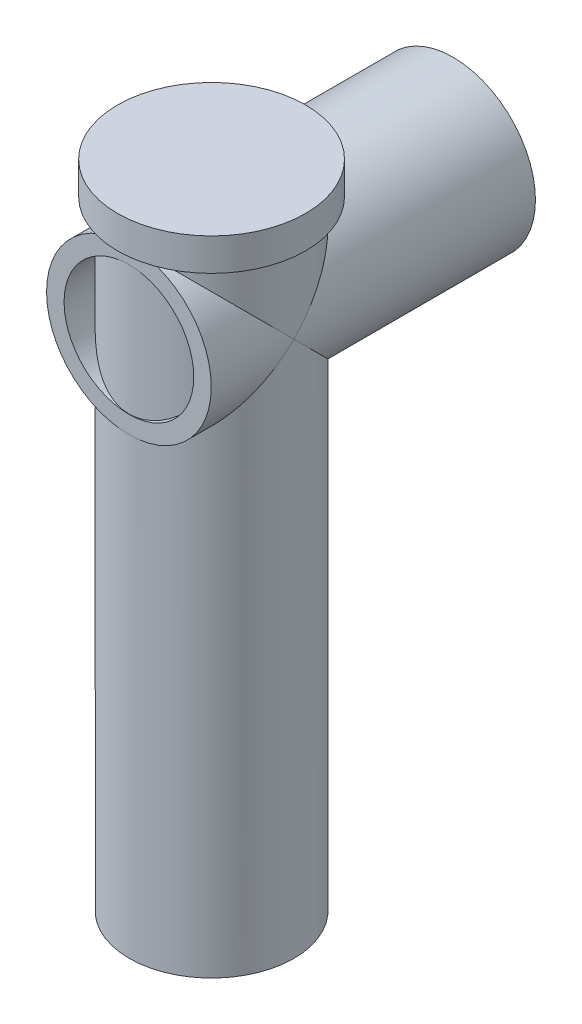
ISO-10303-21;
HEADER;
FILE_DESCRIPTION(('STEP AP214'),'2;1');
FILE_NAME('part.step','',(''),(''),'','','');
FILE_SCHEMA(('AUTOMOTIVE_DESIGN { 1 0 10303 214 1 1 1 1 }'));
ENDSEC;
DATA;
#1=APPLICATION_CONTEXT('core data for automotive mechanical design processes');
#2=APPLICATION_PROTOCOL_DEFINITION('international standard','automotive_design',2000,#1);
#3=PRODUCT_CONTEXT('',#1,'mechanical');
#4=PRODUCT('Part','Part','',(#3));
#5=PRODUCT_RELATED_PRODUCT_CATEGORY('part','',(#4));
#6=PRODUCT_DEFINITION_FORMATION('','',#4);
#7=PRODUCT_DEFINITION_CONTEXT('part definition',#1,'design');
#8=PRODUCT_DEFINITION('design','',#6,#7);
#9=PRODUCT_DEFINITION_SHAPE('','',#8);
#10=(LENGTH_UNIT() NAMED_UNIT(*) SI_UNIT(.MILLI.,.METRE.));
#11=(NAMED_UNIT(*) PLANE_ANGLE_UNIT() SI_UNIT($,.RADIAN.));
#12=(NAMED_UNIT(*) SI_UNIT($,.STERADIAN.) SOLID_ANGLE_UNIT());
#13=UNCERTAINTY_MEASURE_WITH_UNIT(LENGTH_MEASURE(1.E-05),#10,'distance_accuracy_value','');
#14=(GEOMETRIC_REPRESENTATION_CONTEXT(3) GLOBAL_UNCERTAINTY_ASSIGNED_CONTEXT((#13)) GLOBAL_UNIT_ASSIGNED_CONTEXT((#10,
#11,#12)) REPRESENTATION_CONTEXT('',''));
#15=CARTESIAN_POINT('',(0.,0.,0.));
#16=DIRECTION('',(0.,0.,1.));
#17=DIRECTION('',(1.,0.,0.));
#18=AXIS2_PLACEMENT_3D('',#15,#16,#17);
#19=CARTESIAN_POINT('',(0.,17.7,37.25));
#20=DIRECTION('',(0.,-1.,0.));
#21=DIRECTION('',(0.,0.,-1.));
#22=AXIS2_PLACEMENT_3D('',#19,#20,#21);
#23=CYLINDRICAL_SURFACE('',#22,14.5);
#24=CARTESIAN_POINT('',(0.,17.7,37.25));
#25=DIRECTION('',(0.,1.,0.));
#26=DIRECTION('',(0.,0.,1.));
#27=AXIS2_PLACEMENT_3D('',#24,#25,#26);
#28=CIRCLE('',#27,14.5);
#29=CARTESIAN_POINT('',(0.,17.7,51.75));
#30=VERTEX_POINT('',#29);
#31=EDGE_CURVE('E11',#30,#30,#28,.T.);
#32=ORIENTED_EDGE('',*,*,#31,.F.);
#33=EDGE_LOOP('',(#32));
#34=FACE_BOUND('',#33,.T.);
#35=CARTESIAN_POINT('',(0.,12.7,37.25));
#36=DIRECTION('',(0.,1.,0.));
#37=DIRECTION('',(0.,0.,1.));
#38=AXIS2_PLACEMENT_3D('',#35,#36,#37);
#39=CIRCLE('',#38,14.5);
#40=CARTESIAN_POINT('',(0.,12.7,51.75));
#41=VERTEX_POINT('',#40);
#42=EDGE_CURVE('E46',#41,#41,#39,.T.);
#43=ORIENTED_EDGE('',*,*,#42,.T.);
#44=EDGE_LOOP('',(#43));
#45=FACE_BOUND('',#44,.T.);
#46=ADVANCED_FACE('F43',(#34,#45),#23,.T.);
#47=CARTESIAN_POINT('',(0.,17.7,37.25));
#48=DIRECTION('',(0.,1.,0.));
#49=DIRECTION('',(0.,0.,1.));
#50=AXIS2_PLACEMENT_3D('',#47,#48,#49);
#51=PLANE('',#50);
#52=ORIENTED_EDGE('',*,*,#31,.T.);
#53=EDGE_LOOP('',(#52));
#54=FACE_BOUND('',#53,.T.);
#55=ADVANCED_FACE('F58',(#54),#51,.T.);
#56=CARTESIAN_POINT('',(0.,12.7,37.25));
#57=DIRECTION('',(0.,1.,0.));
#58=DIRECTION('',(0.,0.,1.));
#59=AXIS2_PLACEMENT_3D('',#56,#57,#58);
#60=PLANE('',#59);
#61=ORIENTED_EDGE('',*,*,#42,.F.);
#62=EDGE_LOOP('',(#61));
#63=FACE_BOUND('',#62,.T.);
#64=ADVANCED_FACE('F56',(#63),#60,.F.);
#65=CLOSED_SHELL('',(#46,#55,#64));
#66=MANIFOLD_SOLID_BREP('B2',#65);
#67=CARTESIAN_POINT('',(0.,12.7,37.25));
#68=DIRECTION('',(0.,-1.,0.));
#69=DIRECTION('',(0.,0.,-1.));
#70=AXIS2_PLACEMENT_3D('',#67,#68,#69);
#71=CYLINDRICAL_SURFACE('',#70,10.);
#72=CARTESIAN_POINT('',(0.,12.7,37.25));
#73=DIRECTION('',(0.,1.,0.));
#74=DIRECTION('',(0.,0.,1.));
#75=AXIS2_PLACEMENT_3D('',#72,#73,#74);
#76=CIRCLE('',#75,10.);
#77=CARTESIAN_POINT('',(0.,12.7,47.25));
#78=VERTEX_POINT('',#77);
#79=EDGE_CURVE('E177',#78,#78,#76,.T.);
#80=ORIENTED_EDGE('',*,*,#79,.T.);
#81=EDGE_LOOP('',(#80));
#82=FACE_BOUND('',#81,.T.);
#83=CARTESIAN_POINT('',(0.,-82.7,37.25));
#84=DIRECTION('',(0.,1.,0.));
#85=DIRECTION('',(0.,0.,1.));
#86=AXIS2_PLACEMENT_3D('',#83,#84,#85);
#87=CIRCLE('',#86,10.);
#88=CARTESIAN_POINT('',(0.,-82.7,47.25));
#89=VERTEX_POINT('',#88);
#90=EDGE_CURVE('E175',#89,#89,#87,.T.);
#91=ORIENTED_EDGE('',*,*,#90,.F.);
#92=EDGE_LOOP('',(#91));
#93=FACE_BOUND('',#92,.T.);
#94=DIRECTION('',(0.,-1.,0.));
#95=VECTOR('',#94,1.);
#96=CARTESIAN_POINT('',(-8.79985795339902,12.7,42.));
#97=LINE('',#96,#95);
#98=CARTESIAN_POINT('',(-8.79985795339902,4.75,42.));
#99=VERTEX_POINT('',#98);
#100=CARTESIAN_POINT('',(-8.79985795339902,-4.75,42.));
#101=VERTEX_POINT('',#100);
#102=EDGE_CURVE('E167',#99,#101,#97,.T.);
#103=ORIENTED_EDGE('',*,*,#102,.F.);
#104=CARTESIAN_POINT('',(0.,0.,37.25));
#105=DIRECTION('',(0.,-0.707106781186547,0.707106781186547));
#106=DIRECTION('',(0.,-0.707106781186547,-0.707106781186547));
#107=AXIS2_PLACEMENT_3D('',#104,#105,#106);
#108=ELLIPSE('',#107,14.142135623731,10.);
#109=CARTESIAN_POINT('',(-10.,0.,37.25));
#110=VERTEX_POINT('',#109);
#111=EDGE_CURVE('E41',#99,#110,#108,.T.);
#112=ORIENTED_EDGE('',*,*,#111,.T.);
#113=CARTESIAN_POINT('',(0.,0.,37.25));
#114=DIRECTION('',(0.,-0.707106781186547,-0.707106781186547));
#115=DIRECTION('',(0.,-0.707106781186547,0.707106781186547));
#116=AXIS2_PLACEMENT_3D('',#113,#114,#115);
#117=ELLIPSE('',#116,14.142135623731,10.);
#118=CARTESIAN_POINT('',(10.,0.,37.25));
#119=VERTEX_POINT('',#118);
#120=EDGE_CURVE('E163',#110,#119,#117,.T.);
#121=ORIENTED_EDGE('',*,*,#120,.T.);
#122=CARTESIAN_POINT('',(8.79985795339902,4.75,42.));
#123=VERTEX_POINT('',#122);
#124=EDGE_CURVE('E110',#119,#123,#108,.T.);
#125=ORIENTED_EDGE('',*,*,#124,.T.);
#126=DIRECTION('',(0.,-1.,0.));
#127=VECTOR('',#126,1.);
#128=CARTESIAN_POINT('',(8.79985795339902,12.7,42.));
#129=LINE('',#128,#127);
#130=CARTESIAN_POINT('',(8.79985795339902,-4.75,42.));
#131=VERTEX_POINT('',#130);
#132=EDGE_CURVE('E148',#131,#123,#129,.F.);
#133=ORIENTED_EDGE('',*,*,#132,.F.);
#134=CARTESIAN_POINT('',(0.,0.,37.25));
#135=DIRECTION('',(0.,-0.707106781186547,-0.707106781186547));
#136=DIRECTION('',(0.,-0.707106781186547,0.707106781186547));
#137=AXIS2_PLACEMENT_3D('',#134,#135,#136);
#138=ELLIPSE('',#137,14.142135623731,10.);
#139=EDGE_CURVE('E159',#131,#119,#138,.F.);
#140=ORIENTED_EDGE('',*,*,#139,.T.);
#141=CARTESIAN_POINT('',(0.,0.,37.25));
#142=DIRECTION('',(0.,-0.707106781186547,0.707106781186547));
#143=DIRECTION('',(0.,-0.707106781186547,-0.707106781186547));
#144=AXIS2_PLACEMENT_3D('',#141,#142,#143);
#145=ELLIPSE('',#144,14.142135623731,10.);
#146=EDGE_CURVE('E104',#119,#110,#145,.F.);
#147=ORIENTED_EDGE('',*,*,#146,.T.);
#148=EDGE_CURVE('E117',#110,#101,#138,.F.);
#149=ORIENTED_EDGE('',*,*,#148,.T.);
#150=EDGE_LOOP('',(#103,#112,#121,#125,#133,#140,#147,#149));
#151=FACE_BOUND('',#150,.T.);
#152=ADVANCED_FACE('F100',(#82,#93,#151),#71,.F.);
#153=CARTESIAN_POINT('',(0.,0.,50.));
#154=DIRECTION('',(0.,0.,-1.));
#155=DIRECTION('',(-1.,0.,0.));
#156=AXIS2_PLACEMENT_3D('',#153,#154,#155);
#157=CYLINDRICAL_SURFACE('',#156,12.7);
#158=CARTESIAN_POINT('',(0.,0.,50.));
#159=DIRECTION('',(0.,0.,1.));
#160=DIRECTION('',(1.,0.,0.));
#161=AXIS2_PLACEMENT_3D('',#158,#159,#160);
#162=CIRCLE('',#161,12.7);
#163=CARTESIAN_POINT('',(12.7,0.,50.));
#164=VERTEX_POINT('',#163);
#165=EDGE_CURVE('E153',#164,#164,#162,.T.);
#166=ORIENTED_EDGE('',*,*,#165,.F.);
#167=EDGE_LOOP('',(#166));
#168=FACE_BOUND('',#167,.T.);
#169=CARTESIAN_POINT('',(0.,0.,37.25));
#170=DIRECTION('',(0.,0.707106781186547,-0.707106781186547));
#171=DIRECTION('',(0.,-0.707106781186547,-0.707106781186547));
#172=AXIS2_PLACEMENT_3D('',#169,#170,#171);
#173=ELLIPSE('',#172,17.9605122421383,12.7);
#174=CARTESIAN_POINT('',(-12.7,0.,37.25));
#175=VERTEX_POINT('',#174);
#176=CARTESIAN_POINT('',(0.,12.7,49.95));
#177=VERTEX_POINT('',#176);
#178=EDGE_CURVE('E195',#175,#177,#173,.T.);
#179=ORIENTED_EDGE('',*,*,#178,.F.);
#180=CARTESIAN_POINT('',(0.,0.,37.25));
#181=DIRECTION('',(0.,-0.707106781186547,-0.707106781186547));
#182=DIRECTION('',(0.,0.707106781186547,-0.707106781186547));
#183=AXIS2_PLACEMENT_3D('',#180,#181,#182);
#184=ELLIPSE('',#183,17.9605122421383,12.7);
#185=CARTESIAN_POINT('',(12.7,0.,37.25));
#186=VERTEX_POINT('',#185);
#187=EDGE_CURVE('E196',#186,#175,#184,.T.);
#188=ORIENTED_EDGE('',*,*,#187,.F.);
#189=EDGE_CURVE('E192',#177,#186,#173,.T.);
#190=ORIENTED_EDGE('',*,*,#189,.F.);
#191=EDGE_LOOP('',(#179,#188,#190));
#192=FACE_BOUND('',#191,.T.);
#193=ADVANCED_FACE('F102',(#168,#192),#157,.T.);
#194=CARTESIAN_POINT('',(0.,0.,50.));
#195=DIRECTION('',(0.,0.,-1.));
#196=DIRECTION('',(-1.,0.,0.));
#197=AXIS2_PLACEMENT_3D('',#194,#195,#196);
#198=CYLINDRICAL_SURFACE('',#197,10.);
#199=CARTESIAN_POINT('',(0.,0.,50.));
#200=DIRECTION('',(0.,0.,1.));
#201=DIRECTION('',(1.,0.,0.));
#202=AXIS2_PLACEMENT_3D('',#199,#200,#201);
#203=CIRCLE('',#202,10.);
#204=CARTESIAN_POINT('',(10.,0.,50.));
#205=VERTEX_POINT('',#204);
#206=EDGE_CURVE('E203',#205,#205,#203,.T.);
#207=ORIENTED_EDGE('',*,*,#206,.T.);
#208=EDGE_LOOP('',(#207));
#209=FACE_BOUND('',#208,.T.);
#210=CARTESIAN_POINT('',(-10.,0.,45.0787930104199));
#211=CARTESIAN_POINT('',(-9.99999805815857,0.191670573828492,45.0787974832573));
#212=CARTESIAN_POINT('',(-9.99447497746972,0.383406133867141,45.0858662707411));
#213=CARTESIAN_POINT('',(-9.97250884718192,0.765313588756671,45.1138011465454));
#214=CARTESIAN_POINT('',(-9.95605863044523,0.955484374331894,45.134676290453));
#215=CARTESIAN_POINT('',(-9.91255764912071,1.33320244236064,45.1892956225936));
#216=CARTESIAN_POINT('',(-9.88548110310687,1.52074218652995,45.2230711040355));
#217=CARTESIAN_POINT('',(-9.82124585409459,1.89172212520715,45.3020626754452));
#218=CARTESIAN_POINT('',(-9.78408051991939,2.0751595371886,45.347286288738));
#219=CARTESIAN_POINT('',(-9.68623467928203,2.49766040988095,45.4642831618775));
#220=CARTESIAN_POINT('',(-9.62184671726241,2.73480936157186,45.5398773867213));
#221=CARTESIAN_POINT('',(-9.47750904667557,3.19938050771683,45.7045129996511));
#222=CARTESIAN_POINT('',(-9.39755920314871,3.42680261779448,45.7935545043564));
#223=CARTESIAN_POINT('',(-9.22295743665719,3.87226310226318,45.9817562058623));
#224=CARTESIAN_POINT('',(-9.12827082679683,4.09027774636794,46.0809400815186));
#225=CARTESIAN_POINT('',(-8.9251416866759,4.51636484062271,46.2861888604855));
#226=CARTESIAN_POINT('',(-8.81669940984043,4.72443747384041,46.3922536370096));
#227=CARTESIAN_POINT('',(-8.54801303376274,5.19891399563765,46.6449937373182));
#228=CARTESIAN_POINT('',(-8.3825888795235,5.4614938323625,46.7933651888994));
#229=CARTESIAN_POINT('',(-8.02891785999726,5.96927370763319,47.0927753919726));
#230=CARTESIAN_POINT('',(-7.84066333590808,6.21446786992915,47.2438150239496));
#231=CARTESIAN_POINT('',(-7.44191528151569,6.68680303181704,47.5441812009007));
#232=CARTESIAN_POINT('',(-7.23143912090672,6.91395789212142,47.6935089842033));
#233=CARTESIAN_POINT('',(-6.78843061090914,7.34939559617894,47.9867472163022));
#234=CARTESIAN_POINT('',(-6.55590529479926,7.55768441668137,48.130659372261));
#235=CARTESIAN_POINT('',(-6.11584379487886,7.9158544829802,48.3827379290572));
#236=CARTESIAN_POINT('',(-5.91207394660055,8.06927416035829,48.4924646320669));
#237=CARTESIAN_POINT('',(-5.4906663571227,8.36171831040266,48.7041763875731));
#238=CARTESIAN_POINT('',(-5.27303125293626,8.50074550722947,48.8061629041274));
#239=CARTESIAN_POINT('',(-4.82466551725888,8.76298873645464,49.0004138517875));
#240=CARTESIAN_POINT('',(-4.59395046494531,8.88622303148626,49.0926894898833));
#241=CARTESIAN_POINT('',(-4.1200506146922,9.11561535229038,49.2657720111395));
#242=CARTESIAN_POINT('',(-3.87686782347546,9.22177611479476,49.3465807320974));
#243=CARTESIAN_POINT('',(-3.4185008432597,9.40023667616281,49.4832211926097));
#244=CARTESIAN_POINT('',(-3.20494025269987,9.47523613434663,49.5409822362782));
#245=CARTESIAN_POINT('',(-2.77088769686995,9.61113283214116,49.646048373456));
#246=CARTESIAN_POINT('',(-2.55039703034248,9.67203269642288,49.6933554129268));
#247=CARTESIAN_POINT('',(-2.10378627234855,9.77889473180411,49.7765980876453));
#248=CARTESIAN_POINT('',(-1.87766808568913,9.8248618852531,49.8125375156292));
#249=CARTESIAN_POINT('',(-1.42122055951704,9.90119534133085,49.8723256705484));
#250=CARTESIAN_POINT('',(-1.19089116909549,9.93156145523067,49.8961742512181));
#251=CARTESIAN_POINT('',(-0.726961692733212,9.97627220265631,49.931317550063));
#252=CARTESIAN_POINT('',(-0.493353397198388,9.99056432949113,49.9425711252805));
#253=CARTESIAN_POINT('',(-0.0254425280351421,10.0027058079316,49.9521301091889));
#254=CARTESIAN_POINT('',(0.208860046876378,10.0005551291303,49.9504354939353));
#255=CARTESIAN_POINT('',(0.676296590058159,9.97984771297104,49.9341365476772));
#256=CARTESIAN_POINT('',(0.909430490022836,9.96129002766076,49.9195314707413));
#257=CARTESIAN_POINT('',(1.37270197600838,9.90808015378967,49.8777385678919));
#258=CARTESIAN_POINT('',(1.60283962010331,9.8734282776487,49.8505509862296));
#259=CARTESIAN_POINT('',(2.0469685376619,9.79072782975831,49.7858575358539));
#260=CARTESIAN_POINT('',(2.261189086502,9.74344226974809,49.7489406126362));
#261=CARTESIAN_POINT('',(2.68426475138706,9.63547633643378,49.6649608551225));
#262=CARTESIAN_POINT('',(2.89311799114001,9.57479134822565,49.6178945253951));
#263=CARTESIAN_POINT('',(3.30428972001542,9.44078483727433,49.5144447395557));
#264=CARTESIAN_POINT('',(3.5066096703116,9.36746616363139,49.4580633842504));
#265=CARTESIAN_POINT('',(3.90399514548854,9.2089418927794,49.3368524682416));
#266=CARTESIAN_POINT('',(4.09905798804505,9.12373195461382,49.2720198229311));
#267=CARTESIAN_POINT('',(4.50018046600647,8.93322061234472,49.1280533883504));
#268=CARTESIAN_POINT('',(4.70541250179956,8.82676477740118,49.0481389755572));
#269=CARTESIAN_POINT('',(5.10567054917903,8.6014493998431,48.8805325495029));
#270=CARTESIAN_POINT('',(5.30069227902506,8.48258471509463,48.7928373142051));
#271=CARTESIAN_POINT('',(5.86984076804226,8.10869617384204,48.5199469858718));
#272=CARTESIAN_POINT('',(6.22815368247445,7.83632830958103,48.324909293852));
#273=CARTESIAN_POINT('',(6.76631185425463,7.36811214767717,48.0000280330324));
#274=CARTESIAN_POINT('',(6.96049231971981,7.18486999261125,47.8750785321154));
#275=CARTESIAN_POINT('',(7.3326419933312,6.80463720003111,47.6217381666728));
#276=CARTESIAN_POINT('',(7.5106084064748,6.60764420242403,47.4933467137367));
#277=CARTESIAN_POINT('',(7.8502235548401,6.20035492302583,47.235465449886));
#278=CARTESIAN_POINT('',(8.01185552096181,5.99004532331451,47.1059746552395));
#279=CARTESIAN_POINT('',(8.31834737089189,5.55657641275707,46.8487027650908));
#280=CARTESIAN_POINT('',(8.46320966341496,5.33341895422702,46.7209214263883));
#281=CARTESIAN_POINT('',(8.71828021373013,4.90364968657669,46.4862152758828));
#282=CARTESIAN_POINT('',(8.83055080221719,4.69857561031722,46.3787142123633));
#283=CARTESIAN_POINT('',(9.0415405892156,4.27852577588186,46.1697857061226));
#284=CARTESIAN_POINT('',(9.14025875650865,4.06354926587949,46.0683587259156));
#285=CARTESIAN_POINT('',(9.32325074730349,3.62402622743343,45.8746575513922));
#286=CARTESIAN_POINT('',(9.40754957638356,3.39949712707375,45.7823676314126));
#287=CARTESIAN_POINT('',(9.56089956048116,2.94068720655702,45.6101732472699));
#288=CARTESIAN_POINT('',(9.62995677162718,2.7064103037444,45.5302638675783));
#289=CARTESIAN_POINT('',(9.73496351724023,2.29402889090852,45.4062964455178));
#290=CARTESIAN_POINT('',(9.77480385059243,2.11806269580637,45.35840796071));
#291=CARTESIAN_POINT('',(9.84523669585909,1.76188691314449,45.2727423071545));
#292=CARTESIAN_POINT('',(9.87583203398944,1.58167864059292,45.2349620487046));
#293=CARTESIAN_POINT('',(9.92722580295701,1.21812499910667,45.1709771024619));
#294=CARTESIAN_POINT('',(9.94804015318192,1.03478523461886,45.1447536094087));
#295=CARTESIAN_POINT('',(9.97952392559278,0.665858727776321,45.1049190827142));
#296=CARTESIAN_POINT('',(9.99019349892538,0.480272018940462,45.0913078611632));
#297=CARTESIAN_POINT('',(10.0011686811844,0.107468415048885,45.0773052943595));
#298=CARTESIAN_POINT('',(10.0014285355343,-0.0797520598778819,45.0769723119227));
#299=CARTESIAN_POINT('',(9.99146264413141,-0.453447975786698,45.0896898189762));
#300=CARTESIAN_POINT('',(9.98123697732456,-0.639923422367495,45.1027402077025));
#301=CARTESIAN_POINT('',(9.95051979060003,-1.01085584508074,45.1416261539713));
#302=CARTESIAN_POINT('',(9.93001789186583,-1.19531058748593,45.1674746370454));
#303=CARTESIAN_POINT('',(9.8791539943564,-1.56090225214776,45.2308494634334));
#304=CARTESIAN_POINT('',(9.8487859339286,-1.74203706221692,45.268382985303));
#305=CARTESIAN_POINT('',(9.76867027503941,-2.15130807252827,45.3659177566836));
#306=CARTESIAN_POINT('',(9.71586327634931,-2.37804676608787,45.4292750970168));
#307=CARTESIAN_POINT('',(9.59592497711941,-2.82337943368968,45.5696592456558));
#308=CARTESIAN_POINT('',(9.5287864671135,-3.04196924318443,45.6466929305514));
#309=CARTESIAN_POINT('',(9.38102612501862,-3.47101686617402,45.8114610893537));
#310=CARTESIAN_POINT('',(9.30037120727208,-3.68145312588519,45.8992216744679));
#311=CARTESIAN_POINT('',(9.12650377503826,-4.09352458389539,46.0824910103393));
#312=CARTESIAN_POINT('',(9.0332909176341,-4.29515954166008,46.1779999726514));
#313=CARTESIAN_POINT('',(8.79453727792093,-4.76997293998519,46.4143112955965));
#314=CARTESIAN_POINT('',(8.64312972720548,-5.03890798176979,46.5577407814257));
#315=CARTESIAN_POINT('',(8.3176320018612,-5.55979767500253,46.8497329175987));
#316=CARTESIAN_POINT('',(8.14353288842694,-5.81174557510816,46.9982975737852));
#317=CARTESIAN_POINT('',(7.773278397241,-6.29837905308058,47.2960227856914));
#318=CARTESIAN_POINT('',(7.5771285249679,-6.53306891571439,47.4451831837401));
#319=CARTESIAN_POINT('',(7.16308204786583,-6.98455633020726,47.7402269470585));
#320=CARTESIAN_POINT('',(6.94519163619624,-7.20135894558256,47.8861112311598));
#321=CARTESIAN_POINT('',(6.52229880402203,-7.58474468081452,48.1496342840766));
#322=CARTESIAN_POINT('',(6.32028555634529,-7.75397704155372,48.2682216056805));
#323=CARTESIAN_POINT('',(5.90098744249708,-8.07765225852442,48.4983561801894));
#324=CARTESIAN_POINT('',(5.6837051715005,-8.23209761751352,48.6099046233584));
#325=CARTESIAN_POINT('',(5.23457794674048,-8.52472469156405,48.823719031172));
#326=CARTESIAN_POINT('',(5.00275273518928,-8.66292775307268,48.9259971379594));
#327=CARTESIAN_POINT('',(4.52502356168396,-8.9217666955784,49.1193098010466));
#328=CARTESIAN_POINT('',(4.27912232784897,-9.042405964718,49.2103465253489));
#329=CARTESIAN_POINT('',(3.81888472140638,-9.24487478948076,49.3642141601129));
#330=CARTESIAN_POINT('',(3.60662168365548,-9.32979714934888,49.4291885191316));
#331=CARTESIAN_POINT('',(3.17424069067062,-9.4856195473241,49.5489630751082));
#332=CARTESIAN_POINT('',(2.95412433752082,-9.55652242632941,49.6037653331958));
#333=CARTESIAN_POINT('',(2.5072423557922,-9.6833703455738,49.7021507730396));
#334=CARTESIAN_POINT('',(2.28047904352121,-9.73932052929714,49.7457378124565));
#335=CARTESIAN_POINT('',(1.82165139503586,-9.83547259515242,49.8208240950933));
#336=CARTESIAN_POINT('',(1.58958699427523,-9.87567428542177,49.8523231910469));
#337=CARTESIAN_POINT('',(1.12082258850566,-9.93981664654723,49.9026501975764));
#338=CARTESIAN_POINT('',(0.884106948289055,-9.96368669584029,49.9214230740439));
#339=CARTESIAN_POINT('',(0.408890730911164,-9.99447346489567,49.9456452824216));
#340=CARTESIAN_POINT('',(0.170390150405797,-10.0013901528879,49.9510945893639));
#341=CARTESIAN_POINT('',(-0.306407456354153,-9.99814732407787,49.9485412208722));
#342=CARTESIAN_POINT('',(-0.544704493352118,-9.98798877243829,49.9405393057565));
#343=CARTESIAN_POINT('',(-1.01914279690834,-9.95077702820658,49.9112728908696));
#344=CARTESIAN_POINT('',(-1.25528414198709,-9.92372445348609,49.8900088761382));
#345=CARTESIAN_POINT('',(-1.70749954095619,-9.85561259415809,49.8366074509829));
#346=CARTESIAN_POINT('',(-1.92383941049257,-9.81564080068703,49.8053154957865));
#347=CARTESIAN_POINT('',(-2.3517939436588,-9.72198851882831,49.7322354912164));
#348=CARTESIAN_POINT('',(-2.56340698679816,-9.66830340524483,49.6904439006292));
#349=CARTESIAN_POINT('',(-2.98065838839873,-9.54792252803636,49.5971203023841));
#350=CARTESIAN_POINT('',(-3.18629735553965,-9.48122809526907,49.5455892910889));
#351=CARTESIAN_POINT('',(-3.59070640338908,-9.33557875537364,49.4336308773463));
#352=CARTESIAN_POINT('',(-3.78947557695844,-9.25662223657234,49.3732023054981));
#353=CARTESIAN_POINT('',(-4.19493113037283,-9.08048595307556,49.2392326028021));
#354=CARTESIAN_POINT('',(-4.40098532986379,-8.98235519661417,49.1650301635558));
#355=CARTESIAN_POINT('',(-4.80350201811789,-8.77369764916572,49.008529194134));
#356=CARTESIAN_POINT('',(-4.99996402380166,-8.66317023478398,48.9262302568328));
#357=CARTESIAN_POINT('',(-5.38285878536505,-8.43060028331427,48.7547315549168));
#358=CARTESIAN_POINT('',(-5.56928895220244,-8.3085547957813,48.6655300232074));
#359=CARTESIAN_POINT('',(-5.93176396400999,-8.05377333383848,48.4814517143503));
#360=CARTESIAN_POINT('',(-6.10780740778689,-7.92103592274989,48.386574174957));
#361=CARTESIAN_POINT('',(-6.48282145742549,-7.61852395613613,48.173288644845));
#362=CARTESIAN_POINT('',(-6.67950883204925,-7.44659394637307,48.0539176764377));
#363=CARTESIAN_POINT('',(-7.05745595583547,-7.08942333537221,47.8109085203085));
#364=CARTESIAN_POINT('',(-7.23871771477047,-6.90418447393571,47.6872708914405));
#365=CARTESIAN_POINT('',(-7.58594736549982,-6.52076637880485,47.4376971164227));
#366=CARTESIAN_POINT('',(-7.7518936324187,-6.322569503164,47.3117580122117));
#367=CARTESIAN_POINT('',(-8.06801388938606,-5.91387303549313,47.0600945941047));
#368=CARTESIAN_POINT('',(-8.21818916437035,-5.70337444791907,46.9343702635325));
#369=CARTESIAN_POINT('',(-8.49688806783055,-5.27871536853923,46.690646038068));
#370=CARTESIAN_POINT('',(-8.62603086887391,-5.0650243276552,46.5725367982605));
#371=CARTESIAN_POINT('',(-8.86906264786431,-4.62629667852783,46.3416344526658));
#372=CARTESIAN_POINT('',(-8.98294930812613,-4.40125835355709,46.2288421563022));
#373=CARTESIAN_POINT('',(-9.19457853793921,-3.9400533839278,46.0120000292425));
#374=CARTESIAN_POINT('',(-9.29234254922932,-3.70390206503813,45.9079386791639));
#375=CARTESIAN_POINT('',(-9.47081352808136,-3.22025666250128,45.7123409337534));
#376=CARTESIAN_POINT('',(-9.55152925511201,-2.97276848370859,45.6207981149219));
#377=CARTESIAN_POINT('',(-9.67310403141698,-2.54263312749311,45.4796396429746));
#378=CARTESIAN_POINT('',(-9.71866300929067,-2.36273555351754,45.4256735404386));
#379=CARTESIAN_POINT('',(-9.80012720741249,-1.99809332334833,45.3278438783295));
#380=CARTESIAN_POINT('',(-9.83603576740308,-1.81335036836337,45.2839768245106));
#381=CARTESIAN_POINT('',(-9.89752761271168,-1.4403362568203,45.2080985971444));
#382=CARTESIAN_POINT('',(-9.92314205963339,-1.252077581486,45.1760516671587));
#383=CARTESIAN_POINT('',(-9.96366800054479,-0.872724925797174,45.1250491067697));
#384=CARTESIAN_POINT('',(-9.97858680939074,-0.681632974614704,45.1060845295476));
#385=CARTESIAN_POINT('',(-9.99199016702721,-0.40841395830398,45.0890154335866));
#386=CARTESIAN_POINT('',(-9.99499184475385,-0.326817899882708,45.0851865963619));
#387=CARTESIAN_POINT('',(-9.99899732422626,-0.163485180876221,45.0800742412551));
#388=CARTESIAN_POINT('',(-10.0000008282055,-0.0817485011518444,45.0787911027314));
#389=CARTESIAN_POINT('',(-10.,0.,45.0787930104199));
#390=B_SPLINE_CURVE_WITH_KNOTS('',3,(#210,#211,#212,#213,#214,#215,#216,#217,#218,#219,#220,
#221,#222,#223,#224,#225,#226,#227,#228,#229,#230,#231,#232,#233,#234,#235,#236,#237,#238,#239,
#240,#241,#242,#243,#244,#245,#246,#247,#248,#249,#250,#251,#252,#253,#254,#255,#256,#257,#258,
#259,#260,#261,#262,#263,#264,#265,#266,#267,#268,#269,#270,#271,#272,#273,#274,#275,#276,#277,
#278,#279,#280,#281,#282,#283,#284,#285,#286,#287,#288,#289,#290,#291,#292,#293,#294,#295,#296,
#297,#298,#299,#300,#301,#302,#303,#304,#305,#306,#307,#308,#309,#310,#311,#312,#313,#314,#315,
#316,#317,#318,#319,#320,#321,#322,#323,#324,#325,#326,#327,#328,#329,#330,#331,#332,#333,#334,
#335,#336,#337,#338,#339,#340,#341,#342,#343,#344,#345,#346,#347,#348,#349,#350,#351,#352,#353,
#354,#355,#356,#357,#358,#359,#360,#361,#362,#363,#364,#365,#366,#367,#368,#369,#370,#371,#372,
#373,#374,#375,#376,#377,#378,#379,#380,#381,#382,#383,#384,#385,#386,#387,#388,#389),
.UNSPECIFIED.,.T.,.F.,(4,2,2,2,2,2,2,2,2,2,2,2,2,2,2,2,2,2,2,2,2,2,2,2,2,2,2,2,2,2,2,2,2,2,2,2,
2,2,2,2,2,2,2,2,2,2,2,2,2,2,2,2,2,2,2,2,2,2,2,2,2,2,2,2,2,2,2,2,2,2,2,2,2,2,2,2,2,2,2,2,2,2,2,2,
2,2,2,2,2,4),(0.,0.57491928644027,1.15021603681901,1.72691727834511,2.30399849676866,
3.07408382883579,3.84417583972683,4.61610867207376,5.38802728491713,6.41867254138656,
7.44966450521414,8.47985647130158,9.5097209233224,10.3419726053628,11.1740664724646,
12.005189267541,12.836178708133,13.5362714955026,14.2362338540561,14.9359624273572,
15.6356994652177,16.3377156589615,17.0397331509114,17.7417912061755,18.4438356336839,
19.1105054614974,19.7774052565554,20.4441548512954,21.1111484856259,21.844282318923,
22.5777211724678,24.0442410857393,24.9279571417226,25.811825246906,26.6965917135427,
27.5812309385122,28.3526502036702,29.1241281344537,29.8942543207823,30.664073950851,
31.2235938945965,31.7829426183843,32.3413777742129,32.8998046098063,33.460685670422,
34.0215625081643,34.5830069667185,35.1447970244759,35.8674949327003,36.5905572544599,
37.3154160670313,38.0402946771762,39.0598930073351,40.0798942050176,41.0996412992055,
42.1190987261257,42.9852527845197,43.8512599828429,44.716115992541,45.580804945546,
46.2931246322874,47.0052998267813,47.7172297283396,48.429168303011,49.1441663208254,
49.8591656785238,50.5741246228821,51.2890574203019,51.9549731663336,52.6211138080771,
53.2871863391162,53.953346489926,54.6726159148501,55.3919215261348,56.1114118959271,
56.8309991057692,57.6918448629647,58.5525782900315,59.4145090183438,60.2763694665929,
61.1043406711606,61.9324375173079,62.7594240260476,63.5859845869564,64.1652905492501,
64.7443957708675,65.3217345178315,65.8986780392767,66.143847586434,66.3890536658598),.UNSPECIFIED.);
#391=CARTESIAN_POINT('',(-10.,0.,45.0787930104199));
#392=VERTEX_POINT('',#391);
#393=EDGE_CURVE('E189',#392,#392,#390,.T.);
#394=ORIENTED_EDGE('',*,*,#393,.T.);
#395=EDGE_LOOP('',(#394));
#396=FACE_BOUND('',#395,.T.);
#397=ADVANCED_FACE('F218',(#209,#396),#198,.F.);
#398=CARTESIAN_POINT('',(0.,0.,50.));
#399=DIRECTION('',(0.,0.,1.));
#400=DIRECTION('',(1.,0.,0.));
#401=AXIS2_PLACEMENT_3D('',#398,#399,#400);
#402=PLANE('',#401);
#403=ORIENTED_EDGE('',*,*,#165,.T.);
#404=EDGE_LOOP('',(#403));
#405=FACE_BOUND('',#404,.T.);
#406=ORIENTED_EDGE('',*,*,#206,.F.);
#407=EDGE_LOOP('',(#406));
#408=FACE_BOUND('',#407,.T.);
#409=ADVANCED_FACE('F340',(#405,#408),#402,.T.);
#410=CARTESIAN_POINT('',(0.,12.7,37.25));
#411=DIRECTION('',(0.,-1.,0.));
#412=DIRECTION('',(0.,0.,-1.));
#413=AXIS2_PLACEMENT_3D('',#410,#411,#412);
#414=CYLINDRICAL_SURFACE('',#413,12.7);
#415=ORIENTED_EDGE('',*,*,#393,.F.);
#416=EDGE_LOOP('',(#415));
#417=FACE_BOUND('',#416,.T.);
#418=ADVANCED_FACE('F228',(#417),#414,.T.);
#419=CARTESIAN_POINT('',(0.,-82.7,37.25));
#420=DIRECTION('',(0.,1.,0.));
#421=DIRECTION('',(0.,0.,1.));
#422=AXIS2_PLACEMENT_3D('',#419,#420,#421);
#423=PLANE('',#422);
#424=ORIENTED_EDGE('',*,*,#90,.T.);
#425=EDGE_LOOP('',(#424));
#426=FACE_BOUND('',#425,.T.);
#427=CARTESIAN_POINT('',(0.,-82.7,37.25));
#428=DIRECTION('',(0.,1.,0.));
#429=DIRECTION('',(0.,0.,1.));
#430=AXIS2_PLACEMENT_3D('',#427,#428,#429);
#431=CIRCLE('',#430,12.7);
#432=CARTESIAN_POINT('',(0.,-82.7,49.95));
#433=VERTEX_POINT('',#432);
#434=EDGE_CURVE('E182',#433,#433,#431,.T.);
#435=ORIENTED_EDGE('',*,*,#434,.F.);
#436=EDGE_LOOP('',(#435));
#437=FACE_BOUND('',#436,.T.);
#438=ADVANCED_FACE('F233',(#426,#437),#423,.F.);
#439=ORIENTED_EDGE('',*,*,#434,.T.);
#440=EDGE_LOOP('',(#439));
#441=FACE_BOUND('',#440,.T.);
#442=CARTESIAN_POINT('',(0.,0.,37.25));
#443=DIRECTION('',(0.,0.707106781186547,-0.707106781186547));
#444=DIRECTION('',(0.,-0.707106781186547,-0.707106781186547));
#445=AXIS2_PLACEMENT_3D('',#442,#443,#444);
#446=ELLIPSE('',#445,17.9605122421383,12.7);
#447=EDGE_CURVE('E190',#175,#186,#446,.F.);
#448=ORIENTED_EDGE('',*,*,#447,.T.);
#449=ORIENTED_EDGE('',*,*,#187,.T.);
#450=EDGE_LOOP('',(#448,#449));
#451=FACE_BOUND('',#450,.T.);
#452=ADVANCED_FACE('F231',(#441,#451),#414,.T.);
#453=CARTESIAN_POINT('',(0.,12.7,37.25));
#454=DIRECTION('',(0.,1.,0.));
#455=DIRECTION('',(0.,0.,1.));
#456=AXIS2_PLACEMENT_3D('',#453,#454,#455);
#457=PLANE('',#456);
#458=ORIENTED_EDGE('',*,*,#79,.F.);
#459=EDGE_LOOP('',(#458));
#460=FACE_BOUND('',#459,.T.);
#461=CARTESIAN_POINT('',(0.,12.7,37.25));
#462=DIRECTION('',(0.,1.,0.));
#463=DIRECTION('',(0.,0.,1.));
#464=AXIS2_PLACEMENT_3D('',#461,#462,#463);
#465=CIRCLE('',#464,12.7);
#466=CARTESIAN_POINT('',(0.,12.7,24.55));
#467=VERTEX_POINT('',#466);
#468=EDGE_CURVE('E186',#177,#467,#465,.T.);
#469=ORIENTED_EDGE('',*,*,#468,.T.);
#470=EDGE_CURVE('E185',#467,#177,#465,.T.);
#471=ORIENTED_EDGE('',*,*,#470,.T.);
#472=EDGE_LOOP('',(#469,#471));
#473=FACE_BOUND('',#472,.T.);
#474=ADVANCED_FACE('F226',(#460,#473),#457,.T.);
#475=ORIENTED_EDGE('',*,*,#470,.F.);
#476=CARTESIAN_POINT('',(0.,0.,37.25));
#477=DIRECTION('',(0.,-0.707106781186547,-0.707106781186547));
#478=DIRECTION('',(0.,0.707106781186547,-0.707106781186547));
#479=AXIS2_PLACEMENT_3D('',#476,#477,#478);
#480=ELLIPSE('',#479,17.9605122421383,12.7);
#481=EDGE_CURVE('E202',#467,#175,#480,.F.);
#482=ORIENTED_EDGE('',*,*,#481,.T.);
#483=ORIENTED_EDGE('',*,*,#178,.T.);
#484=EDGE_LOOP('',(#475,#482,#483));
#485=FACE_BOUND('',#484,.T.);
#486=ADVANCED_FACE('F221',(#485),#414,.T.);
#487=ORIENTED_EDGE('',*,*,#189,.T.);
#488=EDGE_CURVE('E199',#186,#467,#480,.F.);
#489=ORIENTED_EDGE('',*,*,#488,.T.);
#490=ORIENTED_EDGE('',*,*,#468,.F.);
#491=EDGE_LOOP('',(#487,#489,#490));
#492=FACE_BOUND('',#491,.T.);
#493=ADVANCED_FACE('F225',(#492),#414,.T.);
#494=CARTESIAN_POINT('',(0.,0.,0.));
#495=DIRECTION('',(0.,0.,1.));
#496=DIRECTION('',(1.,0.,0.));
#497=AXIS2_PLACEMENT_3D('',#494,#495,#496);
#498=CIRCLE('',#497,12.7);
#499=CARTESIAN_POINT('',(12.7,0.,0.));
#500=VERTEX_POINT('',#499);
#501=EDGE_CURVE('E206',#500,#500,#498,.T.);
#502=ORIENTED_EDGE('',*,*,#501,.T.);
#503=EDGE_LOOP('',(#502));
#504=FACE_BOUND('',#503,.T.);
#505=ORIENTED_EDGE('',*,*,#447,.F.);
#506=ORIENTED_EDGE('',*,*,#481,.F.);
#507=ORIENTED_EDGE('',*,*,#488,.F.);
#508=EDGE_LOOP('',(#505,#506,#507));
#509=FACE_BOUND('',#508,.T.);
#510=ADVANCED_FACE('F307',(#504,#509),#157,.T.);
#511=CARTESIAN_POINT('',(0.,0.,0.));
#512=DIRECTION('',(0.,0.,1.));
#513=DIRECTION('',(1.,0.,0.));
#514=AXIS2_PLACEMENT_3D('',#511,#512,#513);
#515=PLANE('',#514);
#516=ORIENTED_EDGE('',*,*,#501,.F.);
#517=EDGE_LOOP('',(#516));
#518=FACE_BOUND('',#517,.T.);
#519=CARTESIAN_POINT('',(0.,0.,0.));
#520=DIRECTION('',(0.,0.,1.));
#521=DIRECTION('',(1.,0.,0.));
#522=AXIS2_PLACEMENT_3D('',#519,#520,#521);
#523=CIRCLE('',#522,10.);
#524=CARTESIAN_POINT('',(10.,0.,0.));
#525=VERTEX_POINT('',#524);
#526=EDGE_CURVE('E207',#525,#525,#523,.T.);
#527=ORIENTED_EDGE('',*,*,#526,.T.);
#528=EDGE_LOOP('',(#527));
#529=FACE_BOUND('',#528,.T.);
#530=ADVANCED_FACE('F246',(#518,#529),#515,.F.);
#531=ORIENTED_EDGE('',*,*,#526,.F.);
#532=EDGE_LOOP('',(#531));
#533=FACE_BOUND('',#532,.T.);
#534=ORIENTED_EDGE('',*,*,#146,.F.);
#535=ORIENTED_EDGE('',*,*,#120,.F.);
#536=EDGE_LOOP('',(#534,#535));
#537=FACE_BOUND('',#536,.T.);
#538=ADVANCED_FACE('F172',(#533,#537),#198,.F.);
#539=CARTESIAN_POINT('',(0.,0.,42.));
#540=DIRECTION('',(0.,0.,1.));
#541=DIRECTION('',(1.,0.,0.));
#542=AXIS2_PLACEMENT_3D('',#539,#540,#541);
#543=PLANE('',#542);
#544=ORIENTED_EDGE('',*,*,#132,.T.);
#545=CARTESIAN_POINT('',(0.,0.,42.));
#546=DIRECTION('',(0.,0.,1.));
#547=DIRECTION('',(1.,0.,0.));
#548=AXIS2_PLACEMENT_3D('',#545,#546,#547);
#549=CIRCLE('',#548,10.);
#550=EDGE_CURVE('E124',#131,#123,#549,.T.);
#551=ORIENTED_EDGE('',*,*,#550,.F.);
#552=EDGE_LOOP('',(#544,#551));
#553=FACE_BOUND('',#552,.T.);
#554=ADVANCED_FACE('F149',(#553),#543,.F.);
#555=CARTESIAN_POINT('',(0.,0.,42.));
#556=DIRECTION('',(0.,0.,-1.));
#557=DIRECTION('',(-1.,0.,0.));
#558=AXIS2_PLACEMENT_3D('',#555,#556,#557);
#559=CYLINDRICAL_SURFACE('',#558,10.);
#560=ORIENTED_EDGE('',*,*,#550,.T.);
#561=ORIENTED_EDGE('',*,*,#124,.F.);
#562=ORIENTED_EDGE('',*,*,#139,.F.);
#563=EDGE_LOOP('',(#560,#561,#562));
#564=FACE_BOUND('',#563,.T.);
#565=ADVANCED_FACE('F157',(#564),#559,.F.);
#566=ORIENTED_EDGE('',*,*,#102,.T.);
#567=EDGE_CURVE('E160',#99,#101,#549,.T.);
#568=ORIENTED_EDGE('',*,*,#567,.F.);
#569=EDGE_LOOP('',(#566,#568));
#570=FACE_BOUND('',#569,.T.);
#571=ADVANCED_FACE('F174',(#570),#543,.F.);
#572=ORIENTED_EDGE('',*,*,#111,.F.);
#573=ORIENTED_EDGE('',*,*,#567,.T.);
#574=ORIENTED_EDGE('',*,*,#148,.F.);
#575=EDGE_LOOP('',(#572,#573,#574));
#576=FACE_BOUND('',#575,.T.);
#577=ADVANCED_FACE('F173',(#576),#559,.F.);
#578=CLOSED_SHELL('',(#152,#193,#397,#409,#418,#438,#452,#474,#486,#493,#510,#530,#538,#554,
#565,#571,#577));
#579=MANIFOLD_SOLID_BREP('B6',#578);
#580=ADVANCED_BREP_SHAPE_REPRESENTATION('',(#18,#66,#579),#14);
#581=SHAPE_DEFINITION_REPRESENTATION(#9,#580);
ENDSEC;
END-ISO-10303-21;
